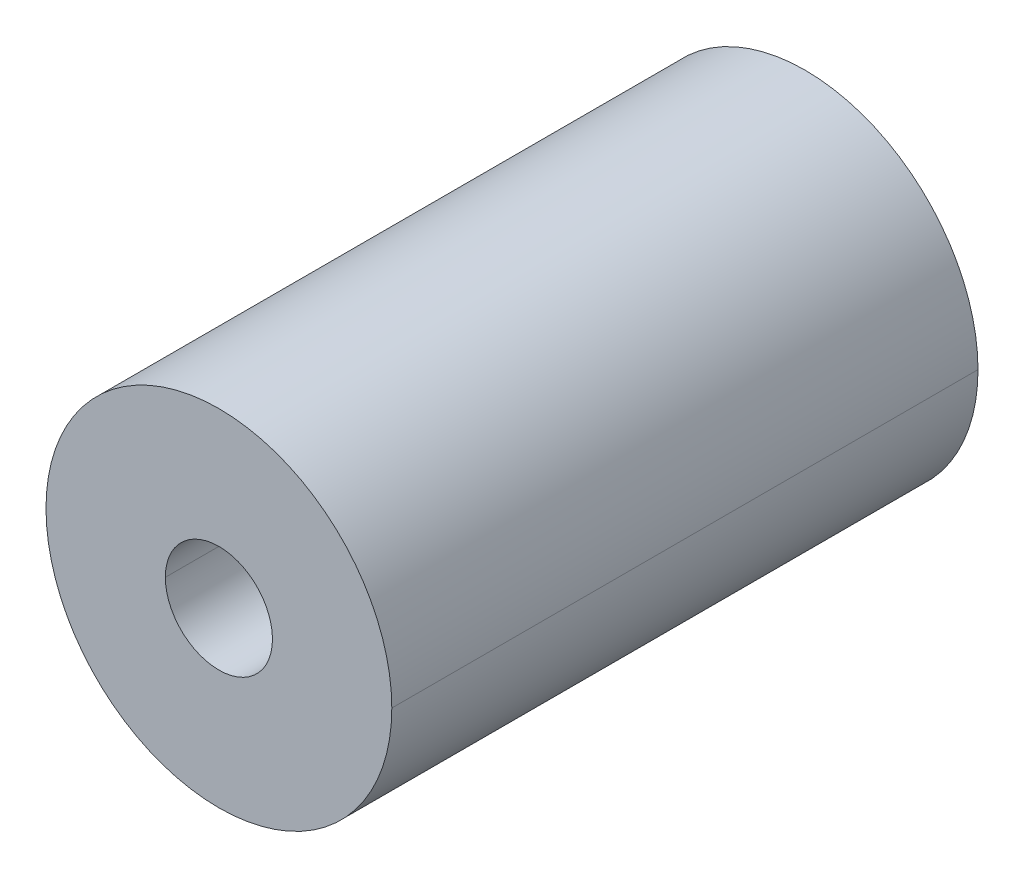
ISO-10303-21;
HEADER;
FILE_DESCRIPTION(('STEP AP214'),'2;1');
FILE_NAME('part.step','',(''),(''),'','','');
FILE_SCHEMA(('AUTOMOTIVE_DESIGN { 1 0 10303 214 1 1 1 1 }'));
ENDSEC;
DATA;
#1=APPLICATION_CONTEXT('core data for automotive mechanical design processes');
#2=APPLICATION_PROTOCOL_DEFINITION('international standard','automotive_design',2000,#1);
#3=PRODUCT_CONTEXT('',#1,'mechanical');
#4=PRODUCT('Part','Part','',(#3));
#5=PRODUCT_RELATED_PRODUCT_CATEGORY('part','',(#4));
#6=PRODUCT_DEFINITION_FORMATION('','',#4);
#7=PRODUCT_DEFINITION_CONTEXT('part definition',#1,'design');
#8=PRODUCT_DEFINITION('design','',#6,#7);
#9=PRODUCT_DEFINITION_SHAPE('','',#8);
#10=(LENGTH_UNIT() NAMED_UNIT(*) SI_UNIT(.MILLI.,.METRE.));
#11=(NAMED_UNIT(*) PLANE_ANGLE_UNIT() SI_UNIT($,.RADIAN.));
#12=(NAMED_UNIT(*) SI_UNIT($,.STERADIAN.) SOLID_ANGLE_UNIT());
#13=UNCERTAINTY_MEASURE_WITH_UNIT(LENGTH_MEASURE(1.E-05),#10,'distance_accuracy_value','');
#14=(GEOMETRIC_REPRESENTATION_CONTEXT(3) GLOBAL_UNCERTAINTY_ASSIGNED_CONTEXT((#13)) GLOBAL_UNIT_ASSIGNED_CONTEXT((#10,
#11,#12)) REPRESENTATION_CONTEXT('',''));
#15=CARTESIAN_POINT('',(0.,0.,0.));
#16=DIRECTION('',(0.,0.,1.));
#17=DIRECTION('',(1.,0.,0.));
#18=AXIS2_PLACEMENT_3D('',#15,#16,#17);
#19=CARTESIAN_POINT('',(0.,0.,-6.95));
#20=DIRECTION('',(0.,0.,1.));
#21=DIRECTION('',(1.,0.,0.));
#22=AXIS2_PLACEMENT_3D('',#19,#20,#21);
#23=CYLINDRICAL_SURFACE('',#22,0.635);
#24=DIRECTION('',(0.,0.,1.));
#25=VECTOR('',#24,1.);
#26=CARTESIAN_POINT('',(-0.635,0.,-6.95));
#27=LINE('',#26,#25);
#28=CARTESIAN_POINT('',(-0.635,0.,-6.95));
#29=VERTEX_POINT('',#28);
#30=CARTESIAN_POINT('',(-0.635,0.,0.));
#31=VERTEX_POINT('',#30);
#32=EDGE_CURVE('E108',#29,#31,#27,.T.);
#33=ORIENTED_EDGE('',*,*,#32,.F.);
#34=CARTESIAN_POINT('',(0.,0.,-6.95));
#35=DIRECTION('',(0.,0.,1.));
#36=DIRECTION('',(1.,0.,0.));
#37=AXIS2_PLACEMENT_3D('',#34,#35,#36);
#38=CIRCLE('',#37,0.635);
#39=CARTESIAN_POINT('',(0.635,0.,-6.95));
#40=VERTEX_POINT('',#39);
#41=EDGE_CURVE('E26',#40,#29,#38,.T.);
#42=ORIENTED_EDGE('',*,*,#41,.F.);
#43=DIRECTION('',(0.,0.,1.));
#44=VECTOR('',#43,1.);
#45=CARTESIAN_POINT('',(0.635,0.,-6.95));
#46=LINE('',#45,#44);
#47=CARTESIAN_POINT('',(0.635,0.,0.));
#48=VERTEX_POINT('',#47);
#49=EDGE_CURVE('E83',#40,#48,#46,.T.);
#50=ORIENTED_EDGE('',*,*,#49,.T.);
#51=CARTESIAN_POINT('',(0.,0.,0.));
#52=DIRECTION('',(0.,0.,1.));
#53=DIRECTION('',(1.,0.,0.));
#54=AXIS2_PLACEMENT_3D('',#51,#52,#53);
#55=CIRCLE('',#54,0.635);
#56=EDGE_CURVE('E11',#48,#31,#55,.T.);
#57=ORIENTED_EDGE('',*,*,#56,.T.);
#58=EDGE_LOOP('',(#33,#42,#50,#57));
#59=FACE_BOUND('',#58,.T.);
#60=ADVANCED_FACE('F17',(#59),#23,.F.);
#61=CARTESIAN_POINT('',(0.,0.,0.));
#62=DIRECTION('',(0.,0.,1.));
#63=DIRECTION('',(1.,0.,0.));
#64=AXIS2_PLACEMENT_3D('',#61,#62,#63);
#65=PLANE('',#64);
#66=CARTESIAN_POINT('',(0.,0.,0.));
#67=DIRECTION('',(0.,0.,1.));
#68=DIRECTION('',(1.,0.,0.));
#69=AXIS2_PLACEMENT_3D('',#66,#67,#68);
#70=CIRCLE('',#69,2.05);
#71=CARTESIAN_POINT('',(2.05,0.,0.));
#72=VERTEX_POINT('',#71);
#73=CARTESIAN_POINT('',(-2.05,0.,0.));
#74=VERTEX_POINT('',#73);
#75=EDGE_CURVE('E79',#72,#74,#70,.T.);
#76=ORIENTED_EDGE('',*,*,#75,.T.);
#77=CARTESIAN_POINT('',(0.,0.,0.));
#78=DIRECTION('',(0.,0.,1.));
#79=DIRECTION('',(1.,0.,0.));
#80=AXIS2_PLACEMENT_3D('',#77,#78,#79);
#81=CIRCLE('',#80,2.05);
#82=EDGE_CURVE('E37',#74,#72,#81,.T.);
#83=ORIENTED_EDGE('',*,*,#82,.T.);
#84=EDGE_LOOP('',(#76,#83));
#85=FACE_BOUND('',#84,.T.);
#86=ORIENTED_EDGE('',*,*,#56,.F.);
#87=CARTESIAN_POINT('',(0.,0.,0.));
#88=DIRECTION('',(0.,0.,1.));
#89=DIRECTION('',(1.,0.,0.));
#90=AXIS2_PLACEMENT_3D('',#87,#88,#89);
#91=CIRCLE('',#90,0.635);
#92=EDGE_CURVE('E90',#31,#48,#91,.T.);
#93=ORIENTED_EDGE('',*,*,#92,.F.);
#94=EDGE_LOOP('',(#86,#93));
#95=FACE_BOUND('',#94,.T.);
#96=ADVANCED_FACE('F135',(#85,#95),#65,.T.);
#97=CARTESIAN_POINT('',(0.,0.,-6.95));
#98=DIRECTION('',(0.,0.,1.));
#99=DIRECTION('',(1.,0.,0.));
#100=AXIS2_PLACEMENT_3D('',#97,#98,#99);
#101=PLANE('',#100);
#102=CARTESIAN_POINT('',(0.,0.,-6.95));
#103=DIRECTION('',(0.,0.,1.));
#104=DIRECTION('',(1.,0.,0.));
#105=AXIS2_PLACEMENT_3D('',#102,#103,#104);
#106=CIRCLE('',#105,2.05);
#107=CARTESIAN_POINT('',(2.05,0.,-6.95));
#108=VERTEX_POINT('',#107);
#109=CARTESIAN_POINT('',(-2.05,0.,-6.95));
#110=VERTEX_POINT('',#109);
#111=EDGE_CURVE('E67',#108,#110,#106,.T.);
#112=ORIENTED_EDGE('',*,*,#111,.F.);
#113=CARTESIAN_POINT('',(0.,0.,-6.95));
#114=DIRECTION('',(0.,0.,1.));
#115=DIRECTION('',(1.,0.,0.));
#116=AXIS2_PLACEMENT_3D('',#113,#114,#115);
#117=CIRCLE('',#116,2.05);
#118=EDGE_CURVE('E62',#110,#108,#117,.T.);
#119=ORIENTED_EDGE('',*,*,#118,.F.);
#120=EDGE_LOOP('',(#112,#119));
#121=FACE_BOUND('',#120,.T.);
#122=ORIENTED_EDGE('',*,*,#41,.T.);
#123=CARTESIAN_POINT('',(0.,0.,-6.95));
#124=DIRECTION('',(0.,0.,1.));
#125=DIRECTION('',(1.,0.,0.));
#126=AXIS2_PLACEMENT_3D('',#123,#124,#125);
#127=CIRCLE('',#126,0.635);
#128=EDGE_CURVE('E119',#29,#40,#127,.T.);
#129=ORIENTED_EDGE('',*,*,#128,.T.);
#130=EDGE_LOOP('',(#122,#129));
#131=FACE_BOUND('',#130,.T.);
#132=ADVANCED_FACE('F64',(#121,#131),#101,.F.);
#133=CARTESIAN_POINT('',(0.,0.,-6.95));
#134=DIRECTION('',(0.,0.,1.));
#135=DIRECTION('',(1.,0.,0.));
#136=AXIS2_PLACEMENT_3D('',#133,#134,#135);
#137=CYLINDRICAL_SURFACE('',#136,2.05);
#138=DIRECTION('',(0.,0.,1.));
#139=VECTOR('',#138,1.);
#140=CARTESIAN_POINT('',(-2.05,0.,-6.95));
#141=LINE('',#140,#139);
#142=EDGE_CURVE('E74',#110,#74,#141,.T.);
#143=ORIENTED_EDGE('',*,*,#142,.F.);
#144=ORIENTED_EDGE('',*,*,#118,.T.);
#145=DIRECTION('',(0.,0.,1.));
#146=VECTOR('',#145,1.);
#147=CARTESIAN_POINT('',(2.05,0.,-6.95));
#148=LINE('',#147,#146);
#149=EDGE_CURVE('E71',#108,#72,#148,.T.);
#150=ORIENTED_EDGE('',*,*,#149,.T.);
#151=ORIENTED_EDGE('',*,*,#82,.F.);
#152=EDGE_LOOP('',(#143,#144,#150,#151));
#153=FACE_BOUND('',#152,.T.);
#154=ADVANCED_FACE('F75',(#153),#137,.T.);
#155=CARTESIAN_POINT('',(0.,0.,-6.95));
#156=DIRECTION('',(0.,0.,1.));
#157=DIRECTION('',(1.,0.,0.));
#158=AXIS2_PLACEMENT_3D('',#155,#156,#157);
#159=CYLINDRICAL_SURFACE('',#158,2.05);
#160=ORIENTED_EDGE('',*,*,#111,.T.);
#161=ORIENTED_EDGE('',*,*,#142,.T.);
#162=ORIENTED_EDGE('',*,*,#75,.F.);
#163=ORIENTED_EDGE('',*,*,#149,.F.);
#164=EDGE_LOOP('',(#160,#161,#162,#163));
#165=FACE_BOUND('',#164,.T.);
#166=ADVANCED_FACE('F81',(#165),#159,.T.);
#167=CARTESIAN_POINT('',(0.,0.,-6.95));
#168=DIRECTION('',(0.,0.,1.));
#169=DIRECTION('',(1.,0.,0.));
#170=AXIS2_PLACEMENT_3D('',#167,#168,#169);
#171=CYLINDRICAL_SURFACE('',#170,0.635);
#172=ORIENTED_EDGE('',*,*,#128,.F.);
#173=ORIENTED_EDGE('',*,*,#32,.T.);
#174=ORIENTED_EDGE('',*,*,#92,.T.);
#175=ORIENTED_EDGE('',*,*,#49,.F.);
#176=EDGE_LOOP('',(#172,#173,#174,#175));
#177=FACE_BOUND('',#176,.T.);
#178=ADVANCED_FACE('F126',(#177),#171,.F.);
#179=CLOSED_SHELL('',(#60,#96,#132,#154,#166,#178));
#180=MANIFOLD_SOLID_BREP('B1',#179);
#181=ADVANCED_BREP_SHAPE_REPRESENTATION('',(#18,#180),#14);
#182=SHAPE_DEFINITION_REPRESENTATION(#9,#181);
ENDSEC;
END-ISO-10303-21;
